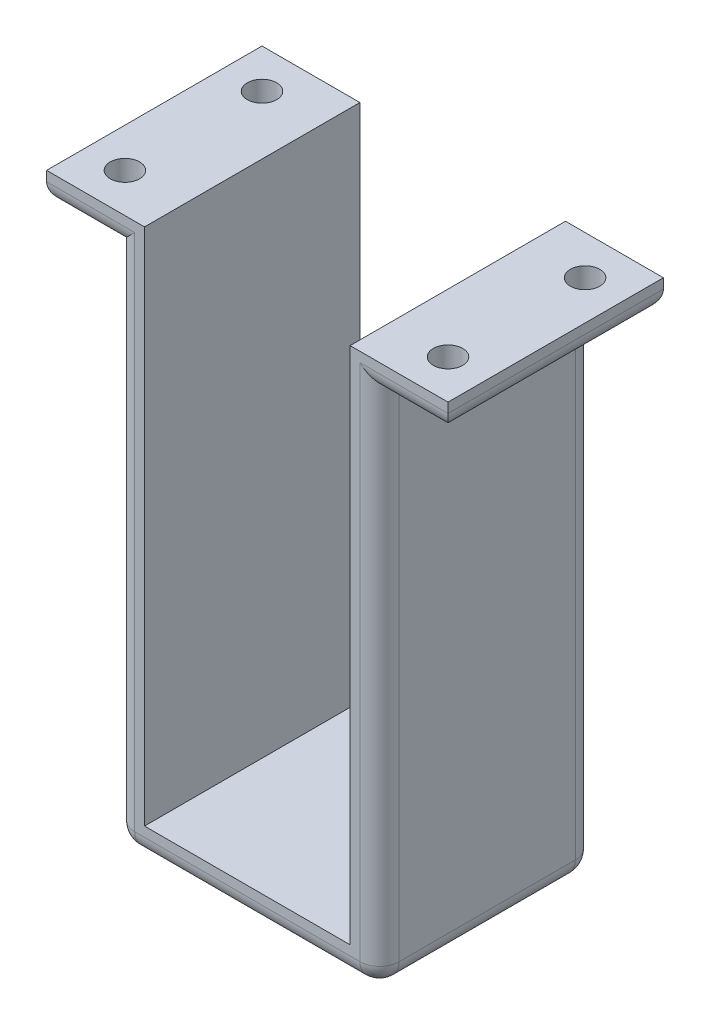
ISO-10303-21;
HEADER;
FILE_DESCRIPTION(('STEP AP214'),'2;1');
FILE_NAME('part.step','',(''),(''),'','','');
FILE_SCHEMA(('AUTOMOTIVE_DESIGN { 1 0 10303 214 1 1 1 1 }'));
ENDSEC;
DATA;
#1=APPLICATION_CONTEXT('core data for automotive mechanical design processes');
#2=APPLICATION_PROTOCOL_DEFINITION('international standard','automotive_design',2000,#1);
#3=PRODUCT_CONTEXT('',#1,'mechanical');
#4=PRODUCT('Part','Part','',(#3));
#5=PRODUCT_RELATED_PRODUCT_CATEGORY('part','',(#4));
#6=PRODUCT_DEFINITION_FORMATION('','',#4);
#7=PRODUCT_DEFINITION_CONTEXT('part definition',#1,'design');
#8=PRODUCT_DEFINITION('design','',#6,#7);
#9=PRODUCT_DEFINITION_SHAPE('','',#8);
#10=(LENGTH_UNIT() NAMED_UNIT(*) SI_UNIT(.MILLI.,.METRE.));
#11=(NAMED_UNIT(*) PLANE_ANGLE_UNIT() SI_UNIT($,.RADIAN.));
#12=(NAMED_UNIT(*) SI_UNIT($,.STERADIAN.) SOLID_ANGLE_UNIT());
#13=UNCERTAINTY_MEASURE_WITH_UNIT(LENGTH_MEASURE(1.E-05),#10,'distance_accuracy_value','');
#14=(GEOMETRIC_REPRESENTATION_CONTEXT(3) GLOBAL_UNCERTAINTY_ASSIGNED_CONTEXT((#13)) GLOBAL_UNIT_ASSIGNED_CONTEXT((#10,
#11,#12)) REPRESENTATION_CONTEXT('',''));
#15=CARTESIAN_POINT('',(0.,0.,0.));
#16=DIRECTION('',(0.,0.,1.));
#17=DIRECTION('',(1.,0.,0.));
#18=AXIS2_PLACEMENT_3D('',#15,#16,#17);
#19=CARTESIAN_POINT('',(0.,-50.,0.));
#20=DIRECTION('',(0.,-1.,0.));
#21=DIRECTION('',(0.,0.,-1.));
#22=AXIS2_PLACEMENT_3D('',#19,#20,#21);
#23=PLANE('',#22);
#24=DIRECTION('',(0.,0.,1.));
#25=VECTOR('',#24,1.);
#26=CARTESIAN_POINT('',(24.,-50.,0.));
#27=LINE('',#26,#25);
#28=CARTESIAN_POINT('',(24.,-50.,0.));
#29=VERTEX_POINT('',#28);
#30=CARTESIAN_POINT('',(24.,-50.,22.));
#31=VERTEX_POINT('',#30);
#32=EDGE_CURVE('E174',#29,#31,#27,.T.);
#33=ORIENTED_EDGE('',*,*,#32,.F.);
#34=DIRECTION('',(1.,0.,0.));
#35=VECTOR('',#34,1.);
#36=CARTESIAN_POINT('',(0.,-50.,0.));
#37=LINE('',#36,#35);
#38=CARTESIAN_POINT('',(3.,-50.,0.));
#39=VERTEX_POINT('',#38);
#40=EDGE_CURVE('E246',#39,#29,#37,.T.);
#41=ORIENTED_EDGE('',*,*,#40,.F.);
#42=DIRECTION('',(0.,0.,-1.));
#43=VECTOR('',#42,1.);
#44=CARTESIAN_POINT('',(3.,-50.,22.));
#45=LINE('',#44,#43);
#46=CARTESIAN_POINT('',(3.,-50.,22.));
#47=VERTEX_POINT('',#46);
#48=EDGE_CURVE('E503',#47,#39,#45,.T.);
#49=ORIENTED_EDGE('',*,*,#48,.F.);
#50=DIRECTION('',(-1.,0.,0.));
#51=VECTOR('',#50,1.);
#52=CARTESIAN_POINT('',(0.,-50.,22.));
#53=LINE('',#52,#51);
#54=EDGE_CURVE('E238',#31,#47,#53,.T.);
#55=ORIENTED_EDGE('',*,*,#54,.F.);
#56=EDGE_LOOP('',(#33,#41,#49,#55));
#57=FACE_BOUND('',#56,.T.);
#58=ADVANCED_FACE('F32',(#57),#23,.F.);
#59=CARTESIAN_POINT('',(3.,0.,22.));
#60=DIRECTION('',(0.,0.,-1.));
#61=DIRECTION('',(0.,1.,0.));
#62=AXIS2_PLACEMENT_3D('',#59,#60,#61);
#63=PLANE('',#62);
#64=DIRECTION('',(0.,-1.,0.));
#65=VECTOR('',#64,1.);
#66=CARTESIAN_POINT('',(-7.,3.,22.));
#67=LINE('',#66,#65);
#68=CARTESIAN_POINT('',(-7.,3.,22.));
#69=VERTEX_POINT('',#68);
#70=CARTESIAN_POINT('',(-7.,2.,22.));
#71=VERTEX_POINT('',#70);
#72=EDGE_CURVE('E230',#69,#71,#67,.T.);
#73=ORIENTED_EDGE('',*,*,#72,.T.);
#74=DIRECTION('',(1.,0.,0.));
#75=VECTOR('',#74,1.);
#76=CARTESIAN_POINT('',(0.,2.,22.));
#77=LINE('',#76,#75);
#78=CARTESIAN_POINT('',(2.,2.,22.));
#79=VERTEX_POINT('',#78);
#80=EDGE_CURVE('E278',#71,#79,#77,.T.);
#81=ORIENTED_EDGE('',*,*,#80,.T.);
#82=DIRECTION('',(0.,-1.,0.));
#83=VECTOR('',#82,1.);
#84=CARTESIAN_POINT('',(2.,0.,22.));
#85=LINE('',#84,#83);
#86=CARTESIAN_POINT('',(2.,-51.,22.));
#87=VERTEX_POINT('',#86);
#88=EDGE_CURVE('E276',#79,#87,#85,.T.);
#89=ORIENTED_EDGE('',*,*,#88,.T.);
#90=DIRECTION('',(-1.,0.,0.));
#91=VECTOR('',#90,1.);
#92=CARTESIAN_POINT('',(27.,-51.,22.));
#93=LINE('',#92,#91);
#94=CARTESIAN_POINT('',(25.,-51.,22.));
#95=VERTEX_POINT('',#94);
#96=EDGE_CURVE('E274',#87,#95,#93,.F.);
#97=ORIENTED_EDGE('',*,*,#96,.T.);
#98=DIRECTION('',(0.,1.,0.));
#99=VECTOR('',#98,1.);
#100=CARTESIAN_POINT('',(25.,0.,22.));
#101=LINE('',#100,#99);
#102=CARTESIAN_POINT('',(25.,2.,22.));
#103=VERTEX_POINT('',#102);
#104=EDGE_CURVE('E272',#95,#103,#101,.T.);
#105=ORIENTED_EDGE('',*,*,#104,.T.);
#106=DIRECTION('',(1.,0.,0.));
#107=VECTOR('',#106,1.);
#108=CARTESIAN_POINT('',(3.,2.,22.));
#109=LINE('',#108,#107);
#110=CARTESIAN_POINT('',(34.,2.,22.));
#111=VERTEX_POINT('',#110);
#112=EDGE_CURVE('E270',#103,#111,#109,.T.);
#113=ORIENTED_EDGE('',*,*,#112,.T.);
#114=DIRECTION('',(0.,-1.,0.));
#115=VECTOR('',#114,1.);
#116=CARTESIAN_POINT('',(34.,3.,22.));
#117=LINE('',#116,#115);
#118=CARTESIAN_POINT('',(34.,3.,22.));
#119=VERTEX_POINT('',#118);
#120=EDGE_CURVE('E185',#119,#111,#117,.T.);
#121=ORIENTED_EDGE('',*,*,#120,.F.);
#122=DIRECTION('',(1.,0.,0.));
#123=VECTOR('',#122,1.);
#124=CARTESIAN_POINT('',(24.,3.,22.));
#125=LINE('',#124,#123);
#126=CARTESIAN_POINT('',(24.,3.,22.));
#127=VERTEX_POINT('',#126);
#128=EDGE_CURVE('E181',#127,#119,#125,.T.);
#129=ORIENTED_EDGE('',*,*,#128,.F.);
#130=DIRECTION('',(0.,-1.,0.));
#131=VECTOR('',#130,1.);
#132=CARTESIAN_POINT('',(24.,0.,22.));
#133=LINE('',#132,#131);
#134=EDGE_CURVE('E168',#127,#31,#133,.T.);
#135=ORIENTED_EDGE('',*,*,#134,.T.);
#136=ORIENTED_EDGE('',*,*,#54,.T.);
#137=DIRECTION('',(0.,-1.,0.));
#138=VECTOR('',#137,1.);
#139=CARTESIAN_POINT('',(3.,0.,22.));
#140=LINE('',#139,#138);
#141=CARTESIAN_POINT('',(3.,3.,22.));
#142=VERTEX_POINT('',#141);
#143=EDGE_CURVE('E506',#142,#47,#140,.T.);
#144=ORIENTED_EDGE('',*,*,#143,.F.);
#145=DIRECTION('',(1.,0.,0.));
#146=VECTOR('',#145,1.);
#147=CARTESIAN_POINT('',(3.,3.,22.));
#148=LINE('',#147,#146);
#149=EDGE_CURVE('E227',#69,#142,#148,.T.);
#150=ORIENTED_EDGE('',*,*,#149,.F.);
#151=EDGE_LOOP('',(#73,#81,#89,#97,#105,#113,#121,#129,#135,#136,#144,#150));
#152=FACE_BOUND('',#151,.T.);
#153=ADVANCED_FACE('F183',(#152),#63,.F.);
#154=CARTESIAN_POINT('',(3.,0.,0.));
#155=DIRECTION('',(0.,0.,1.));
#156=DIRECTION('',(0.,-1.,0.));
#157=AXIS2_PLACEMENT_3D('',#154,#155,#156);
#158=PLANE('',#157);
#159=DIRECTION('',(0.,1.,0.));
#160=VECTOR('',#159,1.);
#161=CARTESIAN_POINT('',(2.,0.,0.));
#162=LINE('',#161,#160);
#163=CARTESIAN_POINT('',(2.,-51.,0.));
#164=VERTEX_POINT('',#163);
#165=CARTESIAN_POINT('',(2.,2.,0.));
#166=VERTEX_POINT('',#165);
#167=EDGE_CURVE('E266',#164,#166,#162,.T.);
#168=ORIENTED_EDGE('',*,*,#167,.T.);
#169=DIRECTION('',(-1.,0.,0.));
#170=VECTOR('',#169,1.);
#171=CARTESIAN_POINT('',(-7.,2.,0.));
#172=LINE('',#171,#170);
#173=CARTESIAN_POINT('',(-7.,2.,0.));
#174=VERTEX_POINT('',#173);
#175=EDGE_CURVE('E268',#166,#174,#172,.T.);
#176=ORIENTED_EDGE('',*,*,#175,.T.);
#177=DIRECTION('',(0.,-1.,0.));
#178=VECTOR('',#177,1.);
#179=CARTESIAN_POINT('',(-7.,3.,0.));
#180=LINE('',#179,#178);
#181=CARTESIAN_POINT('',(-7.,3.,0.));
#182=VERTEX_POINT('',#181);
#183=EDGE_CURVE('E232',#182,#174,#180,.T.);
#184=ORIENTED_EDGE('',*,*,#183,.F.);
#185=DIRECTION('',(-1.,0.,0.));
#186=VECTOR('',#185,1.);
#187=CARTESIAN_POINT('',(3.,3.,0.));
#188=LINE('',#187,#186);
#189=CARTESIAN_POINT('',(3.,3.,0.));
#190=VERTEX_POINT('',#189);
#191=EDGE_CURVE('E223',#190,#182,#188,.T.);
#192=ORIENTED_EDGE('',*,*,#191,.F.);
#193=DIRECTION('',(0.,1.,0.));
#194=VECTOR('',#193,1.);
#195=CARTESIAN_POINT('',(3.,0.,0.));
#196=LINE('',#195,#194);
#197=EDGE_CURVE('E252',#39,#190,#196,.T.);
#198=ORIENTED_EDGE('',*,*,#197,.F.);
#199=ORIENTED_EDGE('',*,*,#40,.T.);
#200=DIRECTION('',(0.,-1.,0.));
#201=VECTOR('',#200,1.);
#202=CARTESIAN_POINT('',(24.,0.,0.));
#203=LINE('',#202,#201);
#204=CARTESIAN_POINT('',(24.,3.,0.));
#205=VERTEX_POINT('',#204);
#206=EDGE_CURVE('E177',#205,#29,#203,.T.);
#207=ORIENTED_EDGE('',*,*,#206,.F.);
#208=DIRECTION('',(-1.,0.,0.));
#209=VECTOR('',#208,1.);
#210=CARTESIAN_POINT('',(24.,3.,0.));
#211=LINE('',#210,#209);
#212=CARTESIAN_POINT('',(34.,3.,0.));
#213=VERTEX_POINT('',#212);
#214=EDGE_CURVE('E194',#213,#205,#211,.T.);
#215=ORIENTED_EDGE('',*,*,#214,.F.);
#216=DIRECTION('',(0.,-1.,0.));
#217=VECTOR('',#216,1.);
#218=CARTESIAN_POINT('',(34.,3.,0.));
#219=LINE('',#218,#217);
#220=CARTESIAN_POINT('',(34.,2.,0.));
#221=VERTEX_POINT('',#220);
#222=EDGE_CURVE('E204',#213,#221,#219,.T.);
#223=ORIENTED_EDGE('',*,*,#222,.T.);
#224=DIRECTION('',(-1.,0.,0.));
#225=VECTOR('',#224,1.);
#226=CARTESIAN_POINT('',(3.,2.,0.));
#227=LINE('',#226,#225);
#228=CARTESIAN_POINT('',(25.,2.,0.));
#229=VERTEX_POINT('',#228);
#230=EDGE_CURVE('E259',#221,#229,#227,.T.);
#231=ORIENTED_EDGE('',*,*,#230,.T.);
#232=DIRECTION('',(0.,1.,0.));
#233=VECTOR('',#232,1.);
#234=CARTESIAN_POINT('',(25.,0.,0.));
#235=LINE('',#234,#233);
#236=CARTESIAN_POINT('',(25.,-51.,0.));
#237=VERTEX_POINT('',#236);
#238=EDGE_CURVE('E261',#229,#237,#235,.F.);
#239=ORIENTED_EDGE('',*,*,#238,.T.);
#240=DIRECTION('',(1.,0.,0.));
#241=VECTOR('',#240,1.);
#242=CARTESIAN_POINT('',(0.,-51.,0.));
#243=LINE('',#242,#241);
#244=EDGE_CURVE('E263',#237,#164,#243,.F.);
#245=ORIENTED_EDGE('',*,*,#244,.T.);
#246=EDGE_LOOP('',(#168,#176,#184,#192,#198,#199,#207,#215,#223,#231,#239,#245));
#247=FACE_BOUND('',#246,.T.);
#248=ADVANCED_FACE('F402',(#247),#158,.F.);
#249=CARTESIAN_POINT('',(3.,0.,0.));
#250=DIRECTION('',(1.,0.,0.));
#251=DIRECTION('',(0.,0.,-1.));
#252=AXIS2_PLACEMENT_3D('',#249,#250,#251);
#253=PLANE('',#252);
#254=ORIENTED_EDGE('',*,*,#143,.T.);
#255=ORIENTED_EDGE('',*,*,#48,.T.);
#256=ORIENTED_EDGE('',*,*,#197,.T.);
#257=DIRECTION('',(0.,0.,-1.));
#258=VECTOR('',#257,1.);
#259=CARTESIAN_POINT('',(3.,3.,0.));
#260=LINE('',#259,#258);
#261=EDGE_CURVE('E218',#142,#190,#260,.T.);
#262=ORIENTED_EDGE('',*,*,#261,.F.);
#263=EDGE_LOOP('',(#254,#255,#256,#262));
#264=FACE_BOUND('',#263,.T.);
#265=ADVANCED_FACE('F413',(#264),#253,.T.);
#266=CARTESIAN_POINT('',(0.,0.,0.));
#267=DIRECTION('',(1.,0.,0.));
#268=DIRECTION('',(0.,0.,-1.));
#269=AXIS2_PLACEMENT_3D('',#266,#267,#268);
#270=PLANE('',#269);
#271=DIRECTION('',(0.,0.,1.));
#272=VECTOR('',#271,1.);
#273=CARTESIAN_POINT('',(0.,0.,22.));
#274=LINE('',#273,#272);
#275=CARTESIAN_POINT('',(0.,0.,2.));
#276=VERTEX_POINT('',#275);
#277=CARTESIAN_POINT('',(0.,0.,20.));
#278=VERTEX_POINT('',#277);
#279=EDGE_CURVE('E508',#276,#278,#274,.T.);
#280=ORIENTED_EDGE('',*,*,#279,.F.);
#281=DIRECTION('',(0.,1.,0.));
#282=VECTOR('',#281,1.);
#283=CARTESIAN_POINT('',(0.,0.,2.));
#284=LINE('',#283,#282);
#285=CARTESIAN_POINT('',(0.,-51.,1.99999999999999));
#286=VERTEX_POINT('',#285);
#287=EDGE_CURVE('E293',#276,#286,#284,.F.);
#288=ORIENTED_EDGE('',*,*,#287,.T.);
#289=DIRECTION('',(0.,0.,-1.));
#290=VECTOR('',#289,1.);
#291=CARTESIAN_POINT('',(0.,-51.,22.));
#292=LINE('',#291,#290);
#293=CARTESIAN_POINT('',(0.,-51.,20.));
#294=VERTEX_POINT('',#293);
#295=EDGE_CURVE('E291',#286,#294,#292,.F.);
#296=ORIENTED_EDGE('',*,*,#295,.T.);
#297=DIRECTION('',(0.,-1.,0.));
#298=VECTOR('',#297,1.);
#299=CARTESIAN_POINT('',(0.,0.,20.));
#300=LINE('',#299,#298);
#301=EDGE_CURVE('E289',#294,#278,#300,.F.);
#302=ORIENTED_EDGE('',*,*,#301,.T.);
#303=EDGE_LOOP('',(#280,#288,#296,#302));
#304=FACE_BOUND('',#303,.T.);
#305=ADVANCED_FACE('F411',(#304),#270,.F.);
#306=CARTESIAN_POINT('',(27.,-53.,22.));
#307=DIRECTION('',(-1.,0.,0.));
#308=DIRECTION('',(0.,0.,1.));
#309=AXIS2_PLACEMENT_3D('',#306,#307,#308);
#310=PLANE('',#309);
#311=DIRECTION('',(0.,0.,-1.));
#312=VECTOR('',#311,1.);
#313=CARTESIAN_POINT('',(27.,0.,0.));
#314=LINE('',#313,#312);
#315=CARTESIAN_POINT('',(27.,0.,20.));
#316=VERTEX_POINT('',#315);
#317=CARTESIAN_POINT('',(27.,0.,2.));
#318=VERTEX_POINT('',#317);
#319=EDGE_CURVE('E178',#316,#318,#314,.T.);
#320=ORIENTED_EDGE('',*,*,#319,.F.);
#321=DIRECTION('',(0.,1.,0.));
#322=VECTOR('',#321,1.);
#323=CARTESIAN_POINT('',(27.,-53.,20.));
#324=LINE('',#323,#322);
#325=CARTESIAN_POINT('',(27.,-51.,20.));
#326=VERTEX_POINT('',#325);
#327=EDGE_CURVE('E300',#316,#326,#324,.F.);
#328=ORIENTED_EDGE('',*,*,#327,.T.);
#329=DIRECTION('',(0.,0.,1.));
#330=VECTOR('',#329,1.);
#331=CARTESIAN_POINT('',(27.,-51.,0.));
#332=LINE('',#331,#330);
#333=CARTESIAN_POINT('',(27.,-51.,1.99999999999999));
#334=VERTEX_POINT('',#333);
#335=EDGE_CURVE('E297',#326,#334,#332,.F.);
#336=ORIENTED_EDGE('',*,*,#335,.T.);
#337=DIRECTION('',(0.,1.,0.));
#338=VECTOR('',#337,1.);
#339=CARTESIAN_POINT('',(27.,-53.,1.99999999999999));
#340=LINE('',#339,#338);
#341=EDGE_CURVE('E295',#334,#318,#340,.T.);
#342=ORIENTED_EDGE('',*,*,#341,.T.);
#343=EDGE_LOOP('',(#320,#328,#336,#342));
#344=FACE_BOUND('',#343,.T.);
#345=ADVANCED_FACE('F408',(#344),#310,.F.);
#346=CARTESIAN_POINT('',(0.,-53.,0.));
#347=DIRECTION('',(0.,-1.,0.));
#348=DIRECTION('',(0.,0.,-1.));
#349=AXIS2_PLACEMENT_3D('',#346,#347,#348);
#350=PLANE('',#349);
#351=DIRECTION('',(-1.,0.,0.));
#352=VECTOR('',#351,1.);
#353=CARTESIAN_POINT('',(0.,-53.,20.));
#354=LINE('',#353,#352);
#355=CARTESIAN_POINT('',(25.,-53.,20.));
#356=VERTEX_POINT('',#355);
#357=CARTESIAN_POINT('',(2.,-53.,20.));
#358=VERTEX_POINT('',#357);
#359=EDGE_CURVE('E251',#356,#358,#354,.T.);
#360=ORIENTED_EDGE('',*,*,#359,.T.);
#361=DIRECTION('',(0.,0.,-1.));
#362=VECTOR('',#361,1.);
#363=CARTESIAN_POINT('',(2.,-53.,0.));
#364=LINE('',#363,#362);
#365=CARTESIAN_POINT('',(2.,-53.,1.99999999999999));
#366=VERTEX_POINT('',#365);
#367=EDGE_CURVE('E257',#358,#366,#364,.T.);
#368=ORIENTED_EDGE('',*,*,#367,.T.);
#369=DIRECTION('',(1.,0.,0.));
#370=VECTOR('',#369,1.);
#371=CARTESIAN_POINT('',(27.,-53.,1.99999999999999));
#372=LINE('',#371,#370);
#373=CARTESIAN_POINT('',(25.,-53.,1.99999999999999));
#374=VERTEX_POINT('',#373);
#375=EDGE_CURVE('E254',#366,#374,#372,.T.);
#376=ORIENTED_EDGE('',*,*,#375,.T.);
#377=DIRECTION('',(0.,0.,1.));
#378=VECTOR('',#377,1.);
#379=CARTESIAN_POINT('',(25.,-53.,22.));
#380=LINE('',#379,#378);
#381=EDGE_CURVE('E249',#374,#356,#380,.T.);
#382=ORIENTED_EDGE('',*,*,#381,.T.);
#383=EDGE_LOOP('',(#360,#368,#376,#382));
#384=FACE_BOUND('',#383,.T.);
#385=ADVANCED_FACE('F406',(#384),#350,.T.);
#386=CARTESIAN_POINT('',(24.,0.,0.));
#387=DIRECTION('',(1.,0.,0.));
#388=DIRECTION('',(0.,0.,-1.));
#389=AXIS2_PLACEMENT_3D('',#386,#387,#388);
#390=PLANE('',#389);
#391=ORIENTED_EDGE('',*,*,#32,.T.);
#392=ORIENTED_EDGE('',*,*,#134,.F.);
#393=DIRECTION('',(0.,0.,1.));
#394=VECTOR('',#393,1.);
#395=CARTESIAN_POINT('',(24.,3.,0.));
#396=LINE('',#395,#394);
#397=EDGE_CURVE('E172',#205,#127,#396,.T.);
#398=ORIENTED_EDGE('',*,*,#397,.F.);
#399=ORIENTED_EDGE('',*,*,#206,.T.);
#400=EDGE_LOOP('',(#391,#392,#398,#399));
#401=FACE_BOUND('',#400,.T.);
#402=ADVANCED_FACE('F170',(#401),#390,.F.);
#403=CARTESIAN_POINT('',(0.,0.,0.));
#404=DIRECTION('',(0.,-1.,0.));
#405=DIRECTION('',(0.,0.,-1.));
#406=AXIS2_PLACEMENT_3D('',#403,#404,#405);
#407=PLANE('',#406);
#408=CARTESIAN_POINT('',(-3.,0.,18.));
#409=DIRECTION('',(0.,1.,0.));
#410=DIRECTION('',(0.,0.,1.));
#411=AXIS2_PLACEMENT_3D('',#408,#409,#410);
#412=CIRCLE('',#411,1.5);
#413=CARTESIAN_POINT('',(-3.,0.,19.5));
#414=VERTEX_POINT('',#413);
#415=EDGE_CURVE('E208',#414,#414,#412,.T.);
#416=ORIENTED_EDGE('',*,*,#415,.T.);
#417=EDGE_LOOP('',(#416));
#418=FACE_BOUND('',#417,.T.);
#419=CARTESIAN_POINT('',(-3.,0.,4.));
#420=DIRECTION('',(0.,1.,0.));
#421=DIRECTION('',(0.,0.,1.));
#422=AXIS2_PLACEMENT_3D('',#419,#420,#421);
#423=CIRCLE('',#422,1.5);
#424=CARTESIAN_POINT('',(-3.,0.,5.5));
#425=VERTEX_POINT('',#424);
#426=EDGE_CURVE('E212',#425,#425,#423,.T.);
#427=ORIENTED_EDGE('',*,*,#426,.T.);
#428=EDGE_LOOP('',(#427));
#429=FACE_BOUND('',#428,.T.);
#430=DIRECTION('',(0.,0.,1.));
#431=VECTOR('',#430,1.);
#432=CARTESIAN_POINT('',(-5.,0.,0.));
#433=LINE('',#432,#431);
#434=CARTESIAN_POINT('',(-5.,0.,20.));
#435=VERTEX_POINT('',#434);
#436=CARTESIAN_POINT('',(-5.,0.,2.));
#437=VERTEX_POINT('',#436);
#438=EDGE_CURVE('E282',#435,#437,#433,.F.);
#439=ORIENTED_EDGE('',*,*,#438,.T.);
#440=DIRECTION('',(-1.,0.,0.));
#441=VECTOR('',#440,1.);
#442=CARTESIAN_POINT('',(0.,0.,2.));
#443=LINE('',#442,#441);
#444=EDGE_CURVE('E284',#437,#276,#443,.F.);
#445=ORIENTED_EDGE('',*,*,#444,.T.);
#446=ORIENTED_EDGE('',*,*,#279,.T.);
#447=DIRECTION('',(1.,0.,0.));
#448=VECTOR('',#447,1.);
#449=CARTESIAN_POINT('',(-7.,0.,20.));
#450=LINE('',#449,#448);
#451=EDGE_CURVE('E280',#278,#435,#450,.F.);
#452=ORIENTED_EDGE('',*,*,#451,.T.);
#453=EDGE_LOOP('',(#439,#445,#446,#452));
#454=FACE_BOUND('',#453,.T.);
#455=ADVANCED_FACE('F554',(#418,#429,#454),#407,.T.);
#456=CARTESIAN_POINT('',(0.,3.,0.));
#457=DIRECTION('',(0.,-1.,0.));
#458=DIRECTION('',(0.,0.,-1.));
#459=AXIS2_PLACEMENT_3D('',#456,#457,#458);
#460=PLANE('',#459);
#461=ORIENTED_EDGE('',*,*,#261,.T.);
#462=ORIENTED_EDGE('',*,*,#191,.T.);
#463=DIRECTION('',(0.,0.,1.));
#464=VECTOR('',#463,1.);
#465=CARTESIAN_POINT('',(-7.,3.,0.));
#466=LINE('',#465,#464);
#467=EDGE_CURVE('E225',#182,#69,#466,.T.);
#468=ORIENTED_EDGE('',*,*,#467,.T.);
#469=ORIENTED_EDGE('',*,*,#149,.T.);
#470=EDGE_LOOP('',(#461,#462,#468,#469));
#471=FACE_BOUND('',#470,.T.);
#472=CARTESIAN_POINT('',(-3.,3.,4.));
#473=DIRECTION('',(0.,1.,0.));
#474=DIRECTION('',(0.,0.,1.));
#475=AXIS2_PLACEMENT_3D('',#472,#473,#474);
#476=CIRCLE('',#475,1.5);
#477=CARTESIAN_POINT('',(-3.,3.,5.5));
#478=VERTEX_POINT('',#477);
#479=EDGE_CURVE('E215',#478,#478,#476,.T.);
#480=ORIENTED_EDGE('',*,*,#479,.F.);
#481=EDGE_LOOP('',(#480));
#482=FACE_BOUND('',#481,.T.);
#483=CARTESIAN_POINT('',(-3.,3.,18.));
#484=DIRECTION('',(0.,1.,0.));
#485=DIRECTION('',(0.,0.,1.));
#486=AXIS2_PLACEMENT_3D('',#483,#484,#485);
#487=CIRCLE('',#486,1.5);
#488=CARTESIAN_POINT('',(-3.,3.,19.5));
#489=VERTEX_POINT('',#488);
#490=EDGE_CURVE('E209',#489,#489,#487,.T.);
#491=ORIENTED_EDGE('',*,*,#490,.F.);
#492=EDGE_LOOP('',(#491));
#493=FACE_BOUND('',#492,.T.);
#494=ADVANCED_FACE('F510',(#471,#482,#493),#460,.F.);
#495=CARTESIAN_POINT('',(-7.,3.,0.));
#496=DIRECTION('',(1.,0.,0.));
#497=DIRECTION('',(0.,0.,-1.));
#498=AXIS2_PLACEMENT_3D('',#495,#496,#497);
#499=PLANE('',#498);
#500=ORIENTED_EDGE('',*,*,#183,.T.);
#501=DIRECTION('',(0.,0.,1.));
#502=VECTOR('',#501,1.);
#503=CARTESIAN_POINT('',(-7.,2.,22.));
#504=LINE('',#503,#502);
#505=EDGE_CURVE('E287',#174,#71,#504,.T.);
#506=ORIENTED_EDGE('',*,*,#505,.T.);
#507=ORIENTED_EDGE('',*,*,#72,.F.);
#508=ORIENTED_EDGE('',*,*,#467,.F.);
#509=EDGE_LOOP('',(#500,#506,#507,#508));
#510=FACE_BOUND('',#509,.T.);
#511=ADVANCED_FACE('F519',(#510),#499,.F.);
#512=CARTESIAN_POINT('',(-3.,3.,4.));
#513=DIRECTION('',(0.,-1.,0.));
#514=DIRECTION('',(0.,0.,-1.));
#515=AXIS2_PLACEMENT_3D('',#512,#513,#514);
#516=CYLINDRICAL_SURFACE('',#515,1.5);
#517=ORIENTED_EDGE('',*,*,#479,.T.);
#518=EDGE_LOOP('',(#517));
#519=FACE_BOUND('',#518,.T.);
#520=ORIENTED_EDGE('',*,*,#426,.F.);
#521=EDGE_LOOP('',(#520));
#522=FACE_BOUND('',#521,.T.);
#523=ADVANCED_FACE('F574',(#519,#522),#516,.F.);
#524=CARTESIAN_POINT('',(-3.,3.,18.));
#525=DIRECTION('',(0.,-1.,0.));
#526=DIRECTION('',(0.,0.,-1.));
#527=AXIS2_PLACEMENT_3D('',#524,#525,#526);
#528=CYLINDRICAL_SURFACE('',#527,1.5);
#529=ORIENTED_EDGE('',*,*,#490,.T.);
#530=EDGE_LOOP('',(#529));
#531=FACE_BOUND('',#530,.T.);
#532=ORIENTED_EDGE('',*,*,#415,.F.);
#533=EDGE_LOOP('',(#532));
#534=FACE_BOUND('',#533,.T.);
#535=ADVANCED_FACE('F578',(#531,#534),#528,.F.);
#536=CARTESIAN_POINT('',(0.,0.,0.));
#537=DIRECTION('',(0.,1.,0.));
#538=DIRECTION('',(0.,0.,1.));
#539=AXIS2_PLACEMENT_3D('',#536,#537,#538);
#540=PLANE('',#539);
#541=ORIENTED_EDGE('',*,*,#319,.T.);
#542=DIRECTION('',(-1.,0.,0.));
#543=VECTOR('',#542,1.);
#544=CARTESIAN_POINT('',(0.,0.,2.));
#545=LINE('',#544,#543);
#546=CARTESIAN_POINT('',(32.,0.,2.));
#547=VERTEX_POINT('',#546);
#548=EDGE_CURVE('E41',#318,#547,#545,.F.);
#549=ORIENTED_EDGE('',*,*,#548,.T.);
#550=DIRECTION('',(0.,0.,-1.));
#551=VECTOR('',#550,1.);
#552=CARTESIAN_POINT('',(32.,0.,0.));
#553=LINE('',#552,#551);
#554=CARTESIAN_POINT('',(32.,0.,20.));
#555=VERTEX_POINT('',#554);
#556=EDGE_CURVE('E49',#547,#555,#553,.F.);
#557=ORIENTED_EDGE('',*,*,#556,.T.);
#558=DIRECTION('',(1.,0.,0.));
#559=VECTOR('',#558,1.);
#560=CARTESIAN_POINT('',(0.,0.,20.));
#561=LINE('',#560,#559);
#562=EDGE_CURVE('E303',#555,#316,#561,.F.);
#563=ORIENTED_EDGE('',*,*,#562,.T.);
#564=EDGE_LOOP('',(#541,#549,#557,#563));
#565=FACE_BOUND('',#564,.T.);
#566=CARTESIAN_POINT('',(30.,0.,18.));
#567=DIRECTION('',(0.,1.,0.));
#568=DIRECTION('',(0.,0.,1.));
#569=AXIS2_PLACEMENT_3D('',#566,#567,#568);
#570=CIRCLE('',#569,1.5);
#571=CARTESIAN_POINT('',(30.,0.,19.5));
#572=VERTEX_POINT('',#571);
#573=EDGE_CURVE('E198',#572,#572,#570,.T.);
#574=ORIENTED_EDGE('',*,*,#573,.T.);
#575=EDGE_LOOP('',(#574));
#576=FACE_BOUND('',#575,.T.);
#577=CARTESIAN_POINT('',(30.,0.,4.));
#578=DIRECTION('',(0.,1.,0.));
#579=DIRECTION('',(0.,0.,1.));
#580=AXIS2_PLACEMENT_3D('',#577,#578,#579);
#581=CIRCLE('',#580,1.50000000000001);
#582=CARTESIAN_POINT('',(30.,0.,5.50000000000001));
#583=VERTEX_POINT('',#582);
#584=EDGE_CURVE('E363',#583,#583,#581,.T.);
#585=ORIENTED_EDGE('',*,*,#584,.T.);
#586=EDGE_LOOP('',(#585));
#587=FACE_BOUND('',#586,.T.);
#588=ADVANCED_FACE('F380',(#565,#576,#587),#540,.F.);
#589=CARTESIAN_POINT('',(0.,3.,0.));
#590=DIRECTION('',(0.,1.,0.));
#591=DIRECTION('',(0.,0.,1.));
#592=AXIS2_PLACEMENT_3D('',#589,#590,#591);
#593=PLANE('',#592);
#594=CARTESIAN_POINT('',(30.,3.,18.));
#595=DIRECTION('',(0.,1.,0.));
#596=DIRECTION('',(0.,0.,1.));
#597=AXIS2_PLACEMENT_3D('',#594,#595,#596);
#598=CIRCLE('',#597,1.5);
#599=CARTESIAN_POINT('',(30.,3.,19.5));
#600=VERTEX_POINT('',#599);
#601=EDGE_CURVE('E195',#600,#600,#598,.T.);
#602=ORIENTED_EDGE('',*,*,#601,.F.);
#603=EDGE_LOOP('',(#602));
#604=FACE_BOUND('',#603,.T.);
#605=ORIENTED_EDGE('',*,*,#397,.T.);
#606=ORIENTED_EDGE('',*,*,#128,.T.);
#607=DIRECTION('',(0.,0.,-1.));
#608=VECTOR('',#607,1.);
#609=CARTESIAN_POINT('',(34.,3.,0.));
#610=LINE('',#609,#608);
#611=EDGE_CURVE('E188',#119,#213,#610,.T.);
#612=ORIENTED_EDGE('',*,*,#611,.T.);
#613=ORIENTED_EDGE('',*,*,#214,.T.);
#614=EDGE_LOOP('',(#605,#606,#612,#613));
#615=FACE_BOUND('',#614,.T.);
#616=CARTESIAN_POINT('',(30.,3.,4.));
#617=DIRECTION('',(0.,1.,0.));
#618=DIRECTION('',(0.,0.,1.));
#619=AXIS2_PLACEMENT_3D('',#616,#617,#618);
#620=CIRCLE('',#619,1.50000000000001);
#621=CARTESIAN_POINT('',(30.,3.,5.50000000000001));
#622=VERTEX_POINT('',#621);
#623=EDGE_CURVE('E369',#622,#622,#620,.T.);
#624=ORIENTED_EDGE('',*,*,#623,.F.);
#625=EDGE_LOOP('',(#624));
#626=FACE_BOUND('',#625,.T.);
#627=ADVANCED_FACE('F191',(#604,#615,#626),#593,.T.);
#628=CARTESIAN_POINT('',(34.,3.,0.));
#629=DIRECTION('',(-1.,0.,0.));
#630=DIRECTION('',(0.,0.,1.));
#631=AXIS2_PLACEMENT_3D('',#628,#629,#630);
#632=PLANE('',#631);
#633=ORIENTED_EDGE('',*,*,#120,.T.);
#634=DIRECTION('',(0.,0.,-1.));
#635=VECTOR('',#634,1.);
#636=CARTESIAN_POINT('',(34.,2.,0.));
#637=LINE('',#636,#635);
#638=EDGE_CURVE('E11',#111,#221,#637,.T.);
#639=ORIENTED_EDGE('',*,*,#638,.T.);
#640=ORIENTED_EDGE('',*,*,#222,.F.);
#641=ORIENTED_EDGE('',*,*,#611,.F.);
#642=EDGE_LOOP('',(#633,#639,#640,#641));
#643=FACE_BOUND('',#642,.T.);
#644=ADVANCED_FACE('F385',(#643),#632,.F.);
#645=CARTESIAN_POINT('',(30.,3.,18.));
#646=DIRECTION('',(0.,-1.,0.));
#647=DIRECTION('',(0.,0.,-1.));
#648=AXIS2_PLACEMENT_3D('',#645,#646,#647);
#649=CYLINDRICAL_SURFACE('',#648,1.5);
#650=ORIENTED_EDGE('',*,*,#601,.T.);
#651=EDGE_LOOP('',(#650));
#652=FACE_BOUND('',#651,.T.);
#653=ORIENTED_EDGE('',*,*,#573,.F.);
#654=EDGE_LOOP('',(#653));
#655=FACE_BOUND('',#654,.T.);
#656=ADVANCED_FACE('F382',(#652,#655),#649,.F.);
#657=CARTESIAN_POINT('',(30.,3.,4.));
#658=DIRECTION('',(0.,-1.,0.));
#659=DIRECTION('',(0.,0.,-1.));
#660=AXIS2_PLACEMENT_3D('',#657,#658,#659);
#661=CYLINDRICAL_SURFACE('',#660,1.50000000000001);
#662=ORIENTED_EDGE('',*,*,#623,.T.);
#663=EDGE_LOOP('',(#662));
#664=FACE_BOUND('',#663,.T.);
#665=ORIENTED_EDGE('',*,*,#584,.F.);
#666=EDGE_LOOP('',(#665));
#667=FACE_BOUND('',#666,.T.);
#668=ADVANCED_FACE('F384',(#664,#667),#661,.F.);
#669=CARTESIAN_POINT('',(3.,2.,20.));
#670=DIRECTION('',(-1.,0.,0.));
#671=DIRECTION('',(0.,0.,1.));
#672=AXIS2_PLACEMENT_3D('',#669,#670,#671);
#673=CYLINDRICAL_SURFACE('',#672,2.);
#674=CARTESIAN_POINT('',(2.,2.,20.));
#675=DIRECTION('',(-0.707106781186547,0.707106781186547,0.));
#676=DIRECTION('',(-0.707106781186547,-0.707106781186547,0.));
#677=AXIS2_PLACEMENT_3D('',#674,#675,#676);
#678=ELLIPSE('',#677,2.82842712474619,2.);
#679=EDGE_CURVE('E356',#79,#278,#678,.F.);
#680=ORIENTED_EDGE('',*,*,#679,.F.);
#681=ORIENTED_EDGE('',*,*,#80,.F.);
#682=CARTESIAN_POINT('',(-5.,2.,20.));
#683=DIRECTION('',(-0.707106781186548,0.,-0.707106781186547));
#684=DIRECTION('',(-0.707106781186547,0.,0.707106781186548));
#685=AXIS2_PLACEMENT_3D('',#682,#683,#684);
#686=ELLIPSE('',#685,2.82842712474619,2.);
#687=EDGE_CURVE('E36',#435,#71,#686,.T.);
#688=ORIENTED_EDGE('',*,*,#687,.F.);
#689=ORIENTED_EDGE('',*,*,#451,.F.);
#690=EDGE_LOOP('',(#680,#681,#688,#689));
#691=FACE_BOUND('',#690,.T.);
#692=ADVANCED_FACE('F34',(#691),#673,.T.);
#693=CARTESIAN_POINT('',(3.,2.,20.));
#694=DIRECTION('',(1.,0.,0.));
#695=DIRECTION('',(0.,0.,-1.));
#696=AXIS2_PLACEMENT_3D('',#693,#694,#695);
#697=CYLINDRICAL_SURFACE('',#696,2.);
#698=CARTESIAN_POINT('',(32.,2.,20.));
#699=DIRECTION('',(0.707106781186547,0.,-0.707106781186548));
#700=DIRECTION('',(-0.707106781186548,0.,-0.707106781186547));
#701=AXIS2_PLACEMENT_3D('',#698,#699,#700);
#702=ELLIPSE('',#701,2.82842712474619,2.);
#703=EDGE_CURVE('E351',#111,#555,#702,.T.);
#704=ORIENTED_EDGE('',*,*,#703,.F.);
#705=ORIENTED_EDGE('',*,*,#112,.F.);
#706=CARTESIAN_POINT('',(25.,2.,20.));
#707=DIRECTION('',(0.707106781186547,0.707106781186547,0.));
#708=DIRECTION('',(-0.707106781186547,0.707106781186547,0.));
#709=AXIS2_PLACEMENT_3D('',#706,#707,#708);
#710=ELLIPSE('',#709,2.82842712474619,2.);
#711=EDGE_CURVE('E354',#316,#103,#710,.F.);
#712=ORIENTED_EDGE('',*,*,#711,.F.);
#713=ORIENTED_EDGE('',*,*,#562,.F.);
#714=EDGE_LOOP('',(#704,#705,#712,#713));
#715=FACE_BOUND('',#714,.T.);
#716=ADVANCED_FACE('F484',(#715),#697,.T.);
#717=CARTESIAN_POINT('',(-5.,2.,0.));
#718=DIRECTION('',(0.,0.,-1.));
#719=DIRECTION('',(-1.,0.,0.));
#720=AXIS2_PLACEMENT_3D('',#717,#718,#719);
#721=CYLINDRICAL_SURFACE('',#720,2.);
#722=ORIENTED_EDGE('',*,*,#687,.T.);
#723=ORIENTED_EDGE('',*,*,#505,.F.);
#724=CARTESIAN_POINT('',(-5.,2.,2.));
#725=DIRECTION('',(0.707106781186547,0.,-0.707106781186548));
#726=DIRECTION('',(-0.707106781186548,0.,-0.707106781186547));
#727=AXIS2_PLACEMENT_3D('',#724,#725,#726);
#728=ELLIPSE('',#727,2.82842712474619,2.);
#729=EDGE_CURVE('E348',#437,#174,#728,.T.);
#730=ORIENTED_EDGE('',*,*,#729,.F.);
#731=ORIENTED_EDGE('',*,*,#438,.F.);
#732=EDGE_LOOP('',(#722,#723,#730,#731));
#733=FACE_BOUND('',#732,.T.);
#734=ADVANCED_FACE('F482',(#733),#721,.T.);
#735=CARTESIAN_POINT('',(2.,0.,20.));
#736=DIRECTION('',(0.,-1.,0.));
#737=DIRECTION('',(0.,0.,-1.));
#738=AXIS2_PLACEMENT_3D('',#735,#736,#737);
#739=CYLINDRICAL_SURFACE('',#738,2.);
#740=ORIENTED_EDGE('',*,*,#679,.T.);
#741=ORIENTED_EDGE('',*,*,#301,.F.);
#742=CARTESIAN_POINT('',(2.,-51.,20.));
#743=DIRECTION('',(0.,-1.,0.));
#744=DIRECTION('',(0.,0.,-1.));
#745=AXIS2_PLACEMENT_3D('',#742,#743,#744);
#746=CIRCLE('',#745,2.);
#747=EDGE_CURVE('E345',#87,#294,#746,.T.);
#748=ORIENTED_EDGE('',*,*,#747,.F.);
#749=ORIENTED_EDGE('',*,*,#88,.F.);
#750=EDGE_LOOP('',(#740,#741,#748,#749));
#751=FACE_BOUND('',#750,.T.);
#752=ADVANCED_FACE('F478',(#751),#739,.T.);
#753=CARTESIAN_POINT('',(0.,-51.,20.));
#754=DIRECTION('',(1.,0.,0.));
#755=DIRECTION('',(0.,0.,-1.));
#756=AXIS2_PLACEMENT_3D('',#753,#754,#755);
#757=CYLINDRICAL_SURFACE('',#756,2.);
#758=CARTESIAN_POINT('',(25.,-51.,20.));
#759=DIRECTION('',(1.,0.,0.));
#760=DIRECTION('',(0.,0.,-1.));
#761=AXIS2_PLACEMENT_3D('',#758,#759,#760);
#762=CIRCLE('',#761,2.);
#763=EDGE_CURVE('E339',#95,#356,#762,.T.);
#764=ORIENTED_EDGE('',*,*,#763,.F.);
#765=ORIENTED_EDGE('',*,*,#96,.F.);
#766=CARTESIAN_POINT('',(2.,-51.,20.));
#767=DIRECTION('',(-1.,0.,0.));
#768=DIRECTION('',(0.,0.,1.));
#769=AXIS2_PLACEMENT_3D('',#766,#767,#768);
#770=CIRCLE('',#769,2.);
#771=EDGE_CURVE('E342',#358,#87,#770,.T.);
#772=ORIENTED_EDGE('',*,*,#771,.F.);
#773=ORIENTED_EDGE('',*,*,#359,.F.);
#774=EDGE_LOOP('',(#764,#765,#772,#773));
#775=FACE_BOUND('',#774,.T.);
#776=ADVANCED_FACE('F474',(#775),#757,.T.);
#777=CARTESIAN_POINT('',(25.,0.,20.));
#778=DIRECTION('',(0.,1.,0.));
#779=DIRECTION('',(0.,0.,1.));
#780=AXIS2_PLACEMENT_3D('',#777,#778,#779);
#781=CYLINDRICAL_SURFACE('',#780,2.);
#782=ORIENTED_EDGE('',*,*,#711,.T.);
#783=ORIENTED_EDGE('',*,*,#104,.F.);
#784=CARTESIAN_POINT('',(25.,-51.,20.));
#785=DIRECTION('',(0.,-1.,0.));
#786=DIRECTION('',(0.,0.,-1.));
#787=AXIS2_PLACEMENT_3D('',#784,#785,#786);
#788=CIRCLE('',#787,2.);
#789=EDGE_CURVE('E336',#326,#95,#788,.T.);
#790=ORIENTED_EDGE('',*,*,#789,.F.);
#791=ORIENTED_EDGE('',*,*,#327,.F.);
#792=EDGE_LOOP('',(#782,#783,#790,#791));
#793=FACE_BOUND('',#792,.T.);
#794=ADVANCED_FACE('F470',(#793),#781,.T.);
#795=CARTESIAN_POINT('',(32.,2.,0.));
#796=DIRECTION('',(0.,0.,-1.));
#797=DIRECTION('',(-1.,0.,0.));
#798=AXIS2_PLACEMENT_3D('',#795,#796,#797);
#799=CYLINDRICAL_SURFACE('',#798,2.);
#800=ORIENTED_EDGE('',*,*,#703,.T.);
#801=ORIENTED_EDGE('',*,*,#556,.F.);
#802=CARTESIAN_POINT('',(32.,2.,2.));
#803=DIRECTION('',(-0.707106781186548,0.,-0.707106781186547));
#804=DIRECTION('',(0.707106781186547,0.,-0.707106781186548));
#805=AXIS2_PLACEMENT_3D('',#802,#803,#804);
#806=ELLIPSE('',#805,2.82842712474619,2.);
#807=EDGE_CURVE('E333',#221,#547,#806,.T.);
#808=ORIENTED_EDGE('',*,*,#807,.F.);
#809=ORIENTED_EDGE('',*,*,#638,.F.);
#810=EDGE_LOOP('',(#800,#801,#808,#809));
#811=FACE_BOUND('',#810,.T.);
#812=ADVANCED_FACE('F466',(#811),#799,.T.);
#813=CARTESIAN_POINT('',(3.,2.,2.));
#814=DIRECTION('',(1.,0.,0.));
#815=DIRECTION('',(0.,0.,-1.));
#816=AXIS2_PLACEMENT_3D('',#813,#814,#815);
#817=CYLINDRICAL_SURFACE('',#816,2.);
#818=ORIENTED_EDGE('',*,*,#729,.T.);
#819=ORIENTED_EDGE('',*,*,#175,.F.);
#820=CARTESIAN_POINT('',(2.,2.,2.));
#821=DIRECTION('',(0.707106781186547,-0.707106781186547,0.));
#822=DIRECTION('',(0.707106781186547,0.707106781186547,0.));
#823=AXIS2_PLACEMENT_3D('',#820,#821,#822);
#824=ELLIPSE('',#823,2.82842712474619,2.);
#825=EDGE_CURVE('E330',#276,#166,#824,.T.);
#826=ORIENTED_EDGE('',*,*,#825,.F.);
#827=ORIENTED_EDGE('',*,*,#444,.F.);
#828=EDGE_LOOP('',(#818,#819,#826,#827));
#829=FACE_BOUND('',#828,.T.);
#830=ADVANCED_FACE('F462',(#829),#817,.T.);
#831=CARTESIAN_POINT('',(2.,-51.,20.));
#832=DIRECTION('',(0.,0.,1.));
#833=DIRECTION('',(1.,0.,0.));
#834=AXIS2_PLACEMENT_3D('',#831,#832,#833);
#835=SPHERICAL_SURFACE('',#834,2.);
#836=ORIENTED_EDGE('',*,*,#771,.T.);
#837=ORIENTED_EDGE('',*,*,#747,.T.);
#838=CARTESIAN_POINT('',(2.,-51.,20.));
#839=DIRECTION('',(0.,0.,1.));
#840=DIRECTION('',(1.,0.,0.));
#841=AXIS2_PLACEMENT_3D('',#838,#839,#840);
#842=CIRCLE('',#841,2.);
#843=EDGE_CURVE('E327',#358,#294,#842,.F.);
#844=ORIENTED_EDGE('',*,*,#843,.F.);
#845=EDGE_LOOP('',(#836,#837,#844));
#846=FACE_BOUND('',#845,.T.);
#847=ADVANCED_FACE('F458',(#846),#835,.T.);
#848=CARTESIAN_POINT('',(25.,-51.,20.));
#849=DIRECTION('',(0.,0.,1.));
#850=DIRECTION('',(1.,0.,0.));
#851=AXIS2_PLACEMENT_3D('',#848,#849,#850);
#852=SPHERICAL_SURFACE('',#851,2.);
#853=ORIENTED_EDGE('',*,*,#789,.T.);
#854=ORIENTED_EDGE('',*,*,#763,.T.);
#855=CARTESIAN_POINT('',(25.,-51.,20.));
#856=DIRECTION('',(0.,0.,1.));
#857=DIRECTION('',(1.,0.,0.));
#858=AXIS2_PLACEMENT_3D('',#855,#856,#857);
#859=CIRCLE('',#858,2.);
#860=EDGE_CURVE('E324',#326,#356,#859,.F.);
#861=ORIENTED_EDGE('',*,*,#860,.F.);
#862=EDGE_LOOP('',(#853,#854,#861));
#863=FACE_BOUND('',#862,.T.);
#864=ADVANCED_FACE('F454',(#863),#852,.T.);
#865=CARTESIAN_POINT('',(3.,2.,2.));
#866=DIRECTION('',(-1.,0.,0.));
#867=DIRECTION('',(0.,0.,1.));
#868=AXIS2_PLACEMENT_3D('',#865,#866,#867);
#869=CYLINDRICAL_SURFACE('',#868,2.);
#870=ORIENTED_EDGE('',*,*,#807,.T.);
#871=ORIENTED_EDGE('',*,*,#548,.F.);
#872=CARTESIAN_POINT('',(25.,2.,2.));
#873=DIRECTION('',(0.707106781186547,0.707106781186547,0.));
#874=DIRECTION('',(-0.707106781186547,0.707106781186547,0.));
#875=AXIS2_PLACEMENT_3D('',#872,#873,#874);
#876=ELLIPSE('',#875,2.82842712474619,2.);
#877=EDGE_CURVE('E321',#229,#318,#876,.F.);
#878=ORIENTED_EDGE('',*,*,#877,.F.);
#879=ORIENTED_EDGE('',*,*,#230,.F.);
#880=EDGE_LOOP('',(#870,#871,#878,#879));
#881=FACE_BOUND('',#880,.T.);
#882=ADVANCED_FACE('F450',(#881),#869,.T.);
#883=CARTESIAN_POINT('',(2.,0.,2.));
#884=DIRECTION('',(0.,1.,0.));
#885=DIRECTION('',(0.,0.,1.));
#886=AXIS2_PLACEMENT_3D('',#883,#884,#885);
#887=CYLINDRICAL_SURFACE('',#886,2.);
#888=ORIENTED_EDGE('',*,*,#825,.T.);
#889=ORIENTED_EDGE('',*,*,#167,.F.);
#890=CARTESIAN_POINT('',(2.,-51.,1.99999999999999));
#891=DIRECTION('',(0.,-1.,0.));
#892=DIRECTION('',(0.,0.,-1.));
#893=AXIS2_PLACEMENT_3D('',#890,#891,#892);
#894=CIRCLE('',#893,2.);
#895=EDGE_CURVE('E318',#286,#164,#894,.T.);
#896=ORIENTED_EDGE('',*,*,#895,.F.);
#897=ORIENTED_EDGE('',*,*,#287,.F.);
#898=EDGE_LOOP('',(#888,#889,#896,#897));
#899=FACE_BOUND('',#898,.T.);
#900=ADVANCED_FACE('F446',(#899),#887,.T.);
#901=CARTESIAN_POINT('',(2.,-51.,0.));
#902=DIRECTION('',(0.,0.,1.));
#903=DIRECTION('',(1.,0.,0.));
#904=AXIS2_PLACEMENT_3D('',#901,#902,#903);
#905=CYLINDRICAL_SURFACE('',#904,2.);
#906=ORIENTED_EDGE('',*,*,#843,.T.);
#907=ORIENTED_EDGE('',*,*,#295,.F.);
#908=CARTESIAN_POINT('',(2.,-51.,1.99999999999999));
#909=DIRECTION('',(0.,0.,-1.));
#910=DIRECTION('',(-1.,0.,0.));
#911=AXIS2_PLACEMENT_3D('',#908,#909,#910);
#912=CIRCLE('',#911,2.);
#913=EDGE_CURVE('E315',#366,#286,#912,.T.);
#914=ORIENTED_EDGE('',*,*,#913,.F.);
#915=ORIENTED_EDGE('',*,*,#367,.F.);
#916=EDGE_LOOP('',(#906,#907,#914,#915));
#917=FACE_BOUND('',#916,.T.);
#918=ADVANCED_FACE('F442',(#917),#905,.T.);
#919=CARTESIAN_POINT('',(25.,-51.,0.));
#920=DIRECTION('',(0.,0.,-1.));
#921=DIRECTION('',(-1.,0.,0.));
#922=AXIS2_PLACEMENT_3D('',#919,#920,#921);
#923=CYLINDRICAL_SURFACE('',#922,2.);
#924=ORIENTED_EDGE('',*,*,#860,.T.);
#925=ORIENTED_EDGE('',*,*,#381,.F.);
#926=CARTESIAN_POINT('',(25.,-51.,1.99999999999999));
#927=DIRECTION('',(0.,0.,-1.));
#928=DIRECTION('',(0.,1.,0.));
#929=AXIS2_PLACEMENT_3D('',#926,#927,#928);
#930=CIRCLE('',#929,2.);
#931=EDGE_CURVE('E312',#334,#374,#930,.T.);
#932=ORIENTED_EDGE('',*,*,#931,.F.);
#933=ORIENTED_EDGE('',*,*,#335,.F.);
#934=EDGE_LOOP('',(#924,#925,#932,#933));
#935=FACE_BOUND('',#934,.T.);
#936=ADVANCED_FACE('F438',(#935),#923,.T.);
#937=CARTESIAN_POINT('',(25.,-53.,1.99999999999999));
#938=DIRECTION('',(0.,1.,0.));
#939=DIRECTION('',(0.,0.,1.));
#940=AXIS2_PLACEMENT_3D('',#937,#938,#939);
#941=CYLINDRICAL_SURFACE('',#940,2.);
#942=ORIENTED_EDGE('',*,*,#877,.T.);
#943=ORIENTED_EDGE('',*,*,#341,.F.);
#944=CARTESIAN_POINT('',(25.,-51.,1.99999999999999));
#945=DIRECTION('',(0.,-1.,0.));
#946=DIRECTION('',(0.,0.,-1.));
#947=AXIS2_PLACEMENT_3D('',#944,#945,#946);
#948=CIRCLE('',#947,2.);
#949=EDGE_CURVE('E310',#237,#334,#948,.T.);
#950=ORIENTED_EDGE('',*,*,#949,.F.);
#951=ORIENTED_EDGE('',*,*,#238,.F.);
#952=EDGE_LOOP('',(#942,#943,#950,#951));
#953=FACE_BOUND('',#952,.T.);
#954=ADVANCED_FACE('F434',(#953),#941,.T.);
#955=CARTESIAN_POINT('',(2.,-51.,1.99999999999999));
#956=DIRECTION('',(0.,0.,1.));
#957=DIRECTION('',(1.,0.,0.));
#958=AXIS2_PLACEMENT_3D('',#955,#956,#957);
#959=SPHERICAL_SURFACE('',#958,2.);
#960=ORIENTED_EDGE('',*,*,#913,.T.);
#961=ORIENTED_EDGE('',*,*,#895,.T.);
#962=CARTESIAN_POINT('',(2.,-51.,1.99999999999999));
#963=DIRECTION('',(-1.,0.,0.));
#964=DIRECTION('',(0.,0.,1.));
#965=AXIS2_PLACEMENT_3D('',#962,#963,#964);
#966=CIRCLE('',#965,2.);
#967=EDGE_CURVE('E308',#366,#164,#966,.F.);
#968=ORIENTED_EDGE('',*,*,#967,.F.);
#969=EDGE_LOOP('',(#960,#961,#968));
#970=FACE_BOUND('',#969,.T.);
#971=ADVANCED_FACE('F430',(#970),#959,.T.);
#972=CARTESIAN_POINT('',(25.,-51.,1.99999999999999));
#973=DIRECTION('',(0.,0.,1.));
#974=DIRECTION('',(1.,0.,0.));
#975=AXIS2_PLACEMENT_3D('',#972,#973,#974);
#976=SPHERICAL_SURFACE('',#975,2.);
#977=ORIENTED_EDGE('',*,*,#949,.T.);
#978=ORIENTED_EDGE('',*,*,#931,.T.);
#979=CARTESIAN_POINT('',(25.,-51.,1.99999999999999));
#980=DIRECTION('',(1.,0.,0.));
#981=DIRECTION('',(0.,0.,-1.));
#982=AXIS2_PLACEMENT_3D('',#979,#980,#981);
#983=CIRCLE('',#982,2.);
#984=EDGE_CURVE('E306',#237,#374,#983,.F.);
#985=ORIENTED_EDGE('',*,*,#984,.F.);
#986=EDGE_LOOP('',(#977,#978,#985));
#987=FACE_BOUND('',#986,.T.);
#988=ADVANCED_FACE('F426',(#987),#976,.T.);
#989=CARTESIAN_POINT('',(0.,-51.,1.99999999999999));
#990=DIRECTION('',(-1.,0.,0.));
#991=DIRECTION('',(0.,0.,1.));
#992=AXIS2_PLACEMENT_3D('',#989,#990,#991);
#993=CYLINDRICAL_SURFACE('',#992,2.);
#994=ORIENTED_EDGE('',*,*,#967,.T.);
#995=ORIENTED_EDGE('',*,*,#244,.F.);
#996=ORIENTED_EDGE('',*,*,#984,.T.);
#997=ORIENTED_EDGE('',*,*,#375,.F.);
#998=EDGE_LOOP('',(#994,#995,#996,#997));
#999=FACE_BOUND('',#998,.T.);
#1000=ADVANCED_FACE('F423',(#999),#993,.T.);
#1001=CLOSED_SHELL('',(#58,#153,#248,#265,#305,#345,#385,#402,#455,#494,#511,#523,#535,#588,
#627,#644,#656,#668,#692,#716,#734,#752,#776,#794,#812,#830,#847,#864,#882,#900,#918,#936,#954,
#971,#988,#1000));
#1002=MANIFOLD_SOLID_BREP('B2',#1001);
#1003=ADVANCED_BREP_SHAPE_REPRESENTATION('',(#18,#1002),#14);
#1004=SHAPE_DEFINITION_REPRESENTATION(#9,#1003);
ENDSEC;
END-ISO-10303-21;
